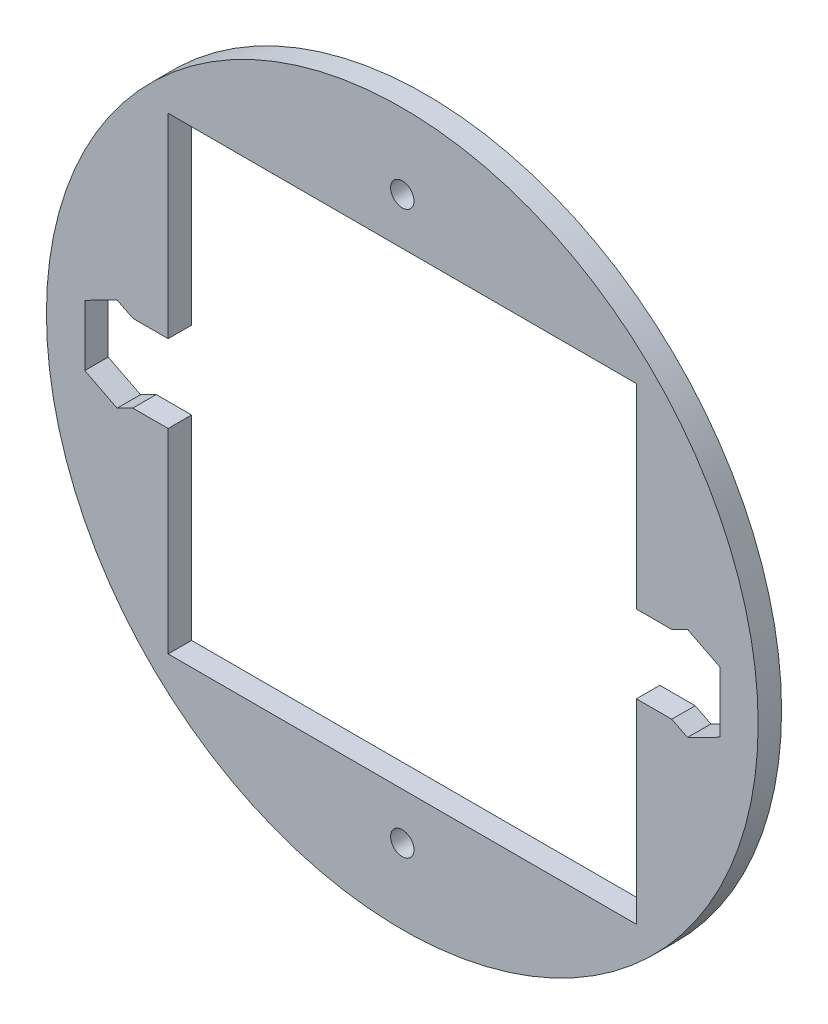
ISO-10303-21;
HEADER;
FILE_DESCRIPTION(('STEP AP214'),'2;1');
FILE_NAME('part.step','',(''),(''),'','','');
FILE_SCHEMA(('AUTOMOTIVE_DESIGN { 1 0 10303 214 1 1 1 1 }'));
ENDSEC;
DATA;
#1=APPLICATION_CONTEXT('core data for automotive mechanical design processes');
#2=APPLICATION_PROTOCOL_DEFINITION('international standard','automotive_design',2000,#1);
#3=PRODUCT_CONTEXT('',#1,'mechanical');
#4=PRODUCT('Part','Part','',(#3));
#5=PRODUCT_RELATED_PRODUCT_CATEGORY('part','',(#4));
#6=PRODUCT_DEFINITION_FORMATION('','',#4);
#7=PRODUCT_DEFINITION_CONTEXT('part definition',#1,'design');
#8=PRODUCT_DEFINITION('design','',#6,#7);
#9=PRODUCT_DEFINITION_SHAPE('','',#8);
#10=(LENGTH_UNIT() NAMED_UNIT(*) SI_UNIT(.MILLI.,.METRE.));
#11=(NAMED_UNIT(*) PLANE_ANGLE_UNIT() SI_UNIT($,.RADIAN.));
#12=(NAMED_UNIT(*) SI_UNIT($,.STERADIAN.) SOLID_ANGLE_UNIT());
#13=UNCERTAINTY_MEASURE_WITH_UNIT(LENGTH_MEASURE(1.E-05),#10,'distance_accuracy_value','');
#14=(GEOMETRIC_REPRESENTATION_CONTEXT(3) GLOBAL_UNCERTAINTY_ASSIGNED_CONTEXT((#13)) GLOBAL_UNIT_ASSIGNED_CONTEXT((#10,
#11,#12)) REPRESENTATION_CONTEXT('',''));
#15=CARTESIAN_POINT('',(0.,0.,0.));
#16=DIRECTION('',(0.,0.,1.));
#17=DIRECTION('',(1.,0.,0.));
#18=AXIS2_PLACEMENT_3D('',#15,#16,#17);
#19=CARTESIAN_POINT('',(-50.,50.,0.));
#20=DIRECTION('',(-1.,0.,0.));
#21=DIRECTION('',(0.,-1.,0.));
#22=AXIS2_PLACEMENT_3D('',#19,#20,#21);
#23=PLANE('',#22);
#24=DIRECTION('',(0.,-1.,0.));
#25=VECTOR('',#24,1.);
#26=CARTESIAN_POINT('',(-50.,50.,0.));
#27=LINE('',#26,#25);
#28=CARTESIAN_POINT('',(-50.,-8.3,0.));
#29=VERTEX_POINT('',#28);
#30=CARTESIAN_POINT('',(-50.,-50.,0.));
#31=VERTEX_POINT('',#30);
#32=EDGE_CURVE('E309',#29,#31,#27,.T.);
#33=ORIENTED_EDGE('',*,*,#32,.F.);
#34=DIRECTION('',(0.,0.,1.));
#35=VECTOR('',#34,1.);
#36=CARTESIAN_POINT('',(-50.,-8.3,0.));
#37=LINE('',#36,#35);
#38=CARTESIAN_POINT('',(-50.,-8.3,5.));
#39=VERTEX_POINT('',#38);
#40=EDGE_CURVE('E226',#29,#39,#37,.T.);
#41=ORIENTED_EDGE('',*,*,#40,.T.);
#42=DIRECTION('',(0.,-1.,0.));
#43=VECTOR('',#42,1.);
#44=CARTESIAN_POINT('',(-50.,50.,5.));
#45=LINE('',#44,#43);
#46=CARTESIAN_POINT('',(-50.,-50.,5.));
#47=VERTEX_POINT('',#46);
#48=EDGE_CURVE('E298',#39,#47,#45,.T.);
#49=ORIENTED_EDGE('',*,*,#48,.T.);
#50=DIRECTION('',(0.,0.,1.));
#51=VECTOR('',#50,1.);
#52=CARTESIAN_POINT('',(-50.,-50.,0.));
#53=LINE('',#52,#51);
#54=EDGE_CURVE('E318',#31,#47,#53,.T.);
#55=ORIENTED_EDGE('',*,*,#54,.F.);
#56=EDGE_LOOP('',(#33,#41,#49,#55));
#57=FACE_BOUND('',#56,.T.);
#58=ADVANCED_FACE('F33',(#57),#23,.F.);
#59=CARTESIAN_POINT('',(50.,50.,0.));
#60=DIRECTION('',(1.,0.,0.));
#61=DIRECTION('',(0.,1.,0.));
#62=AXIS2_PLACEMENT_3D('',#59,#60,#61);
#63=PLANE('',#62);
#64=DIRECTION('',(0.,1.,0.));
#65=VECTOR('',#64,1.);
#66=CARTESIAN_POINT('',(50.,50.,5.));
#67=LINE('',#66,#65);
#68=CARTESIAN_POINT('',(50.,-50.,5.));
#69=VERTEX_POINT('',#68);
#70=CARTESIAN_POINT('',(50.,-8.3,5.));
#71=VERTEX_POINT('',#70);
#72=EDGE_CURVE('E326',#69,#71,#67,.T.);
#73=ORIENTED_EDGE('',*,*,#72,.T.);
#74=DIRECTION('',(0.,0.,1.));
#75=VECTOR('',#74,1.);
#76=CARTESIAN_POINT('',(50.,-8.3,0.));
#77=LINE('',#76,#75);
#78=CARTESIAN_POINT('',(50.,-8.3,0.));
#79=VERTEX_POINT('',#78);
#80=EDGE_CURVE('E290',#79,#71,#77,.T.);
#81=ORIENTED_EDGE('',*,*,#80,.F.);
#82=DIRECTION('',(0.,1.,0.));
#83=VECTOR('',#82,1.);
#84=CARTESIAN_POINT('',(50.,50.,0.));
#85=LINE('',#84,#83);
#86=CARTESIAN_POINT('',(50.,-50.,0.));
#87=VERTEX_POINT('',#86);
#88=EDGE_CURVE('E313',#87,#79,#85,.T.);
#89=ORIENTED_EDGE('',*,*,#88,.F.);
#90=DIRECTION('',(0.,0.,1.));
#91=VECTOR('',#90,1.);
#92=CARTESIAN_POINT('',(50.,-50.,0.));
#93=LINE('',#92,#91);
#94=EDGE_CURVE('E337',#87,#69,#93,.T.);
#95=ORIENTED_EDGE('',*,*,#94,.T.);
#96=EDGE_LOOP('',(#73,#81,#89,#95));
#97=FACE_BOUND('',#96,.T.);
#98=ADVANCED_FACE('F358',(#97),#63,.F.);
#99=CARTESIAN_POINT('',(0.,0.,5.));
#100=DIRECTION('',(0.,0.,-1.));
#101=DIRECTION('',(-1.,0.,0.));
#102=AXIS2_PLACEMENT_3D('',#99,#100,#101);
#103=CYLINDRICAL_SURFACE('',#102,76.);
#104=CARTESIAN_POINT('',(0.,0.,5.));
#105=DIRECTION('',(0.,0.,1.));
#106=DIRECTION('',(1.,0.,0.));
#107=AXIS2_PLACEMENT_3D('',#104,#105,#106);
#108=CIRCLE('',#107,76.);
#109=CARTESIAN_POINT('',(76.,0.,5.));
#110=VERTEX_POINT('',#109);
#111=EDGE_CURVE('E11',#110,#110,#108,.T.);
#112=ORIENTED_EDGE('',*,*,#111,.F.);
#113=EDGE_LOOP('',(#112));
#114=FACE_BOUND('',#113,.T.);
#115=CARTESIAN_POINT('',(0.,0.,0.));
#116=DIRECTION('',(0.,0.,1.));
#117=DIRECTION('',(1.,0.,0.));
#118=AXIS2_PLACEMENT_3D('',#115,#116,#117);
#119=CIRCLE('',#118,76.);
#120=CARTESIAN_POINT('',(76.,0.,0.));
#121=VERTEX_POINT('',#120);
#122=EDGE_CURVE('E37',#121,#121,#119,.T.);
#123=ORIENTED_EDGE('',*,*,#122,.T.);
#124=EDGE_LOOP('',(#123));
#125=FACE_BOUND('',#124,.T.);
#126=ADVANCED_FACE('F35',(#114,#125),#103,.T.);
#127=CARTESIAN_POINT('',(0.,0.,5.));
#128=DIRECTION('',(0.,0.,1.));
#129=DIRECTION('',(1.,0.,0.));
#130=AXIS2_PLACEMENT_3D('',#127,#128,#129);
#131=PLANE('',#130);
#132=DIRECTION('',(1.,0.,0.));
#133=VECTOR('',#132,1.);
#134=CARTESIAN_POINT('',(-50.,-8.3,5.));
#135=LINE('',#134,#133);
#136=CARTESIAN_POINT('',(-57.55,-8.3,5.));
#137=VERTEX_POINT('',#136);
#138=EDGE_CURVE('E194',#137,#39,#135,.T.);
#139=ORIENTED_EDGE('',*,*,#138,.F.);
#140=DIRECTION('',(0.891953238375036,0.452127659574469,0.));
#141=VECTOR('',#140,1.);
#142=CARTESIAN_POINT('',(-57.55,-8.3,5.));
#143=LINE('',#142,#141);
#144=CARTESIAN_POINT('',(-60.9037441762901,-10.,5.));
#145=VERTEX_POINT('',#144);
#146=EDGE_CURVE('E196',#145,#137,#143,.T.);
#147=ORIENTED_EDGE('',*,*,#146,.F.);
#148=DIRECTION('',(0.891918399697068,-0.452196382428941,0.));
#149=VECTOR('',#148,1.);
#150=CARTESIAN_POINT('',(-60.9037441762901,-10.,5.));
#151=LINE('',#150,#149);
#152=CARTESIAN_POINT('',(-67.8071925899454,-6.5,5.));
#153=VERTEX_POINT('',#152);
#154=EDGE_CURVE('E221',#153,#145,#151,.T.);
#155=ORIENTED_EDGE('',*,*,#154,.F.);
#156=DIRECTION('',(0.,-1.,0.));
#157=VECTOR('',#156,1.);
#158=CARTESIAN_POINT('',(-67.8071925899454,-6.5,5.));
#159=LINE('',#158,#157);
#160=CARTESIAN_POINT('',(-67.8071925899454,6.5,5.));
#161=VERTEX_POINT('',#160);
#162=EDGE_CURVE('E218',#161,#153,#159,.T.);
#163=ORIENTED_EDGE('',*,*,#162,.F.);
#164=DIRECTION('',(-0.891918399697068,-0.45219638242894,0.));
#165=VECTOR('',#164,1.);
#166=CARTESIAN_POINT('',(-67.8071925899454,6.5,5.));
#167=LINE('',#166,#165);
#168=CARTESIAN_POINT('',(-60.9037441762901,10.,5.));
#169=VERTEX_POINT('',#168);
#170=EDGE_CURVE('E215',#169,#161,#167,.T.);
#171=ORIENTED_EDGE('',*,*,#170,.F.);
#172=DIRECTION('',(-0.891953238375035,0.45212765957447,0.));
#173=VECTOR('',#172,1.);
#174=CARTESIAN_POINT('',(-60.9037441762901,10.,5.));
#175=LINE('',#174,#173);
#176=CARTESIAN_POINT('',(-57.55,8.3,5.));
#177=VERTEX_POINT('',#176);
#178=EDGE_CURVE('E212',#177,#169,#175,.T.);
#179=ORIENTED_EDGE('',*,*,#178,.F.);
#180=DIRECTION('',(-1.,0.,0.));
#181=VECTOR('',#180,1.);
#182=CARTESIAN_POINT('',(-57.55,8.3,5.));
#183=LINE('',#182,#181);
#184=CARTESIAN_POINT('',(-50.,8.3,5.));
#185=VERTEX_POINT('',#184);
#186=EDGE_CURVE('E172',#185,#177,#183,.T.);
#187=ORIENTED_EDGE('',*,*,#186,.F.);
#188=CARTESIAN_POINT('',(-50.,50.,5.));
#189=VERTEX_POINT('',#188);
#190=EDGE_CURVE('E319',#189,#185,#45,.T.);
#191=ORIENTED_EDGE('',*,*,#190,.F.);
#192=DIRECTION('',(-1.,0.,0.));
#193=VECTOR('',#192,1.);
#194=CARTESIAN_POINT('',(50.,50.,5.));
#195=LINE('',#194,#193);
#196=CARTESIAN_POINT('',(50.,50.,5.));
#197=VERTEX_POINT('',#196);
#198=EDGE_CURVE('E329',#197,#189,#195,.T.);
#199=ORIENTED_EDGE('',*,*,#198,.F.);
#200=CARTESIAN_POINT('',(50.,8.3,5.));
#201=VERTEX_POINT('',#200);
#202=EDGE_CURVE('E325',#201,#197,#67,.T.);
#203=ORIENTED_EDGE('',*,*,#202,.F.);
#204=DIRECTION('',(-1.,0.,0.));
#205=VECTOR('',#204,1.);
#206=CARTESIAN_POINT('',(57.55,8.3,5.));
#207=LINE('',#206,#205);
#208=CARTESIAN_POINT('',(57.55,8.3,5.));
#209=VERTEX_POINT('',#208);
#210=EDGE_CURVE('E56',#209,#201,#207,.T.);
#211=ORIENTED_EDGE('',*,*,#210,.F.);
#212=DIRECTION('',(-0.891953238375037,-0.452127659574467,0.));
#213=VECTOR('',#212,1.);
#214=CARTESIAN_POINT('',(60.9037441762901,9.99999999999999,5.));
#215=LINE('',#214,#213);
#216=CARTESIAN_POINT('',(60.9037441762901,9.99999999999999,5.));
#217=VERTEX_POINT('',#216);
#218=EDGE_CURVE('E263',#217,#209,#215,.T.);
#219=ORIENTED_EDGE('',*,*,#218,.F.);
#220=DIRECTION('',(-0.891918399697068,0.452196382428941,0.));
#221=VECTOR('',#220,1.);
#222=CARTESIAN_POINT('',(67.8071925899454,6.49999999999999,5.));
#223=LINE('',#222,#221);
#224=CARTESIAN_POINT('',(67.8071925899454,6.49999999999999,5.));
#225=VERTEX_POINT('',#224);
#226=EDGE_CURVE('E244',#225,#217,#223,.T.);
#227=ORIENTED_EDGE('',*,*,#226,.F.);
#228=DIRECTION('',(0.,1.,0.));
#229=VECTOR('',#228,1.);
#230=CARTESIAN_POINT('',(67.8071925899454,-6.5,5.));
#231=LINE('',#230,#229);
#232=CARTESIAN_POINT('',(67.8071925899454,-6.5,5.));
#233=VERTEX_POINT('',#232);
#234=EDGE_CURVE('E276',#233,#225,#231,.T.);
#235=ORIENTED_EDGE('',*,*,#234,.F.);
#236=DIRECTION('',(0.891918399697068,0.452196382428941,0.));
#237=VECTOR('',#236,1.);
#238=CARTESIAN_POINT('',(60.9037441762901,-10.,5.));
#239=LINE('',#238,#237);
#240=CARTESIAN_POINT('',(60.9037441762901,-10.,5.));
#241=VERTEX_POINT('',#240);
#242=EDGE_CURVE('E273',#241,#233,#239,.T.);
#243=ORIENTED_EDGE('',*,*,#242,.F.);
#244=DIRECTION('',(0.891953238375036,-0.452127659574469,0.));
#245=VECTOR('',#244,1.);
#246=CARTESIAN_POINT('',(57.55,-8.3,5.));
#247=LINE('',#246,#245);
#248=CARTESIAN_POINT('',(57.55,-8.3,5.));
#249=VERTEX_POINT('',#248);
#250=EDGE_CURVE('E270',#249,#241,#247,.T.);
#251=ORIENTED_EDGE('',*,*,#250,.F.);
#252=DIRECTION('',(1.,0.,0.));
#253=VECTOR('',#252,1.);
#254=CARTESIAN_POINT('',(50.,-8.3,5.));
#255=LINE('',#254,#253);
#256=EDGE_CURVE('E267',#71,#249,#255,.T.);
#257=ORIENTED_EDGE('',*,*,#256,.F.);
#258=ORIENTED_EDGE('',*,*,#72,.F.);
#259=DIRECTION('',(1.,0.,0.));
#260=VECTOR('',#259,1.);
#261=CARTESIAN_POINT('',(50.,-50.,5.));
#262=LINE('',#261,#260);
#263=EDGE_CURVE('E322',#47,#69,#262,.T.);
#264=ORIENTED_EDGE('',*,*,#263,.F.);
#265=ORIENTED_EDGE('',*,*,#48,.F.);
#266=EDGE_LOOP('',(#139,#147,#155,#163,#171,#179,#187,#191,#199,#203,#211,#219,#227,#235,#243,
#251,#257,#258,#264,#265));
#267=FACE_BOUND('',#266,.T.);
#268=CARTESIAN_POINT('',(0.,60.,5.));
#269=DIRECTION('',(0.,0.,1.));
#270=DIRECTION('',(1.,0.,0.));
#271=AXIS2_PLACEMENT_3D('',#268,#269,#270);
#272=CIRCLE('',#271,2.5);
#273=CARTESIAN_POINT('',(2.50000000000001,60.,5.));
#274=VERTEX_POINT('',#273);
#275=EDGE_CURVE('E299',#274,#274,#272,.T.);
#276=ORIENTED_EDGE('',*,*,#275,.F.);
#277=EDGE_LOOP('',(#276));
#278=FACE_BOUND('',#277,.T.);
#279=CARTESIAN_POINT('',(0.,-60.,5.));
#280=DIRECTION('',(0.,0.,1.));
#281=DIRECTION('',(1.,0.,0.));
#282=AXIS2_PLACEMENT_3D('',#279,#280,#281);
#283=CIRCLE('',#282,2.5);
#284=CARTESIAN_POINT('',(2.5,-60.,5.));
#285=VERTEX_POINT('',#284);
#286=EDGE_CURVE('E229',#285,#285,#283,.T.);
#287=ORIENTED_EDGE('',*,*,#286,.F.);
#288=EDGE_LOOP('',(#287));
#289=FACE_BOUND('',#288,.T.);
#290=ORIENTED_EDGE('',*,*,#111,.T.);
#291=EDGE_LOOP('',(#290));
#292=FACE_BOUND('',#291,.T.);
#293=ADVANCED_FACE('F352',(#267,#278,#289,#292),#131,.T.);
#294=CARTESIAN_POINT('',(0.,0.,0.));
#295=DIRECTION('',(0.,0.,1.));
#296=DIRECTION('',(1.,0.,0.));
#297=AXIS2_PLACEMENT_3D('',#294,#295,#296);
#298=PLANE('',#297);
#299=CARTESIAN_POINT('',(0.,60.,0.));
#300=DIRECTION('',(0.,0.,1.));
#301=DIRECTION('',(1.,0.,0.));
#302=AXIS2_PLACEMENT_3D('',#299,#300,#301);
#303=CIRCLE('',#302,2.5);
#304=CARTESIAN_POINT('',(2.50000000000001,60.,0.));
#305=VERTEX_POINT('',#304);
#306=EDGE_CURVE('E295',#305,#305,#303,.T.);
#307=ORIENTED_EDGE('',*,*,#306,.T.);
#308=EDGE_LOOP('',(#307));
#309=FACE_BOUND('',#308,.T.);
#310=CARTESIAN_POINT('',(0.,-60.,0.));
#311=DIRECTION('',(0.,0.,1.));
#312=DIRECTION('',(1.,0.,0.));
#313=AXIS2_PLACEMENT_3D('',#310,#311,#312);
#314=CIRCLE('',#313,2.5);
#315=CARTESIAN_POINT('',(2.5,-60.,0.));
#316=VERTEX_POINT('',#315);
#317=EDGE_CURVE('E302',#316,#316,#314,.T.);
#318=ORIENTED_EDGE('',*,*,#317,.T.);
#319=EDGE_LOOP('',(#318));
#320=FACE_BOUND('',#319,.T.);
#321=DIRECTION('',(0.891953238375036,0.452127659574469,0.));
#322=VECTOR('',#321,1.);
#323=CARTESIAN_POINT('',(-57.55,-8.3,0.));
#324=LINE('',#323,#322);
#325=CARTESIAN_POINT('',(-60.9037441762901,-10.,0.));
#326=VERTEX_POINT('',#325);
#327=CARTESIAN_POINT('',(-57.55,-8.3,0.));
#328=VERTEX_POINT('',#327);
#329=EDGE_CURVE('E206',#326,#328,#324,.T.);
#330=ORIENTED_EDGE('',*,*,#329,.T.);
#331=DIRECTION('',(1.,0.,0.));
#332=VECTOR('',#331,1.);
#333=CARTESIAN_POINT('',(-50.,-8.3,0.));
#334=LINE('',#333,#332);
#335=EDGE_CURVE('E208',#328,#29,#334,.T.);
#336=ORIENTED_EDGE('',*,*,#335,.T.);
#337=ORIENTED_EDGE('',*,*,#32,.T.);
#338=DIRECTION('',(1.,0.,0.));
#339=VECTOR('',#338,1.);
#340=CARTESIAN_POINT('',(50.,-50.,0.));
#341=LINE('',#340,#339);
#342=EDGE_CURVE('E308',#31,#87,#341,.T.);
#343=ORIENTED_EDGE('',*,*,#342,.T.);
#344=ORIENTED_EDGE('',*,*,#88,.T.);
#345=DIRECTION('',(1.,0.,0.));
#346=VECTOR('',#345,1.);
#347=CARTESIAN_POINT('',(50.,-8.3,0.));
#348=LINE('',#347,#346);
#349=CARTESIAN_POINT('',(57.55,-8.3,0.));
#350=VERTEX_POINT('',#349);
#351=EDGE_CURVE('E247',#79,#350,#348,.T.);
#352=ORIENTED_EDGE('',*,*,#351,.T.);
#353=DIRECTION('',(0.891953238375036,-0.452127659574469,0.));
#354=VECTOR('',#353,1.);
#355=CARTESIAN_POINT('',(57.55,-8.3,0.));
#356=LINE('',#355,#354);
#357=CARTESIAN_POINT('',(60.9037441762901,-10.,0.));
#358=VERTEX_POINT('',#357);
#359=EDGE_CURVE('E250',#350,#358,#356,.T.);
#360=ORIENTED_EDGE('',*,*,#359,.T.);
#361=DIRECTION('',(0.891918399697068,0.452196382428941,0.));
#362=VECTOR('',#361,1.);
#363=CARTESIAN_POINT('',(60.9037441762901,-10.,0.));
#364=LINE('',#363,#362);
#365=CARTESIAN_POINT('',(67.8071925899454,-6.5,0.));
#366=VERTEX_POINT('',#365);
#367=EDGE_CURVE('E253',#358,#366,#364,.T.);
#368=ORIENTED_EDGE('',*,*,#367,.T.);
#369=DIRECTION('',(0.,1.,0.));
#370=VECTOR('',#369,1.);
#371=CARTESIAN_POINT('',(67.8071925899454,-6.5,0.));
#372=LINE('',#371,#370);
#373=CARTESIAN_POINT('',(67.8071925899454,6.49999999999999,0.));
#374=VERTEX_POINT('',#373);
#375=EDGE_CURVE('E256',#366,#374,#372,.T.);
#376=ORIENTED_EDGE('',*,*,#375,.T.);
#377=DIRECTION('',(-0.891918399697068,0.452196382428941,0.));
#378=VECTOR('',#377,1.);
#379=CARTESIAN_POINT('',(67.8071925899454,6.49999999999999,0.));
#380=LINE('',#379,#378);
#381=CARTESIAN_POINT('',(60.9037441762901,9.99999999999999,0.));
#382=VERTEX_POINT('',#381);
#383=EDGE_CURVE('E259',#374,#382,#380,.T.);
#384=ORIENTED_EDGE('',*,*,#383,.T.);
#385=DIRECTION('',(-0.891953238375037,-0.452127659574467,0.));
#386=VECTOR('',#385,1.);
#387=CARTESIAN_POINT('',(60.9037441762901,9.99999999999999,0.));
#388=LINE('',#387,#386);
#389=CARTESIAN_POINT('',(57.55,8.3,0.));
#390=VERTEX_POINT('',#389);
#391=EDGE_CURVE('E240',#382,#390,#388,.T.);
#392=ORIENTED_EDGE('',*,*,#391,.T.);
#393=DIRECTION('',(-1.,0.,0.));
#394=VECTOR('',#393,1.);
#395=CARTESIAN_POINT('',(57.55,8.3,0.));
#396=LINE('',#395,#394);
#397=CARTESIAN_POINT('',(50.,8.3,0.));
#398=VERTEX_POINT('',#397);
#399=EDGE_CURVE('E243',#390,#398,#396,.T.);
#400=ORIENTED_EDGE('',*,*,#399,.T.);
#401=CARTESIAN_POINT('',(50.,50.,0.));
#402=VERTEX_POINT('',#401);
#403=EDGE_CURVE('E312',#398,#402,#85,.T.);
#404=ORIENTED_EDGE('',*,*,#403,.T.);
#405=DIRECTION('',(-1.,0.,0.));
#406=VECTOR('',#405,1.);
#407=CARTESIAN_POINT('',(50.,50.,0.));
#408=LINE('',#407,#406);
#409=CARTESIAN_POINT('',(-50.,50.,0.));
#410=VERTEX_POINT('',#409);
#411=EDGE_CURVE('E316',#402,#410,#408,.T.);
#412=ORIENTED_EDGE('',*,*,#411,.T.);
#413=CARTESIAN_POINT('',(-50.,8.3,0.));
#414=VERTEX_POINT('',#413);
#415=EDGE_CURVE('E193',#410,#414,#27,.T.);
#416=ORIENTED_EDGE('',*,*,#415,.T.);
#417=DIRECTION('',(-1.,0.,0.));
#418=VECTOR('',#417,1.);
#419=CARTESIAN_POINT('',(-57.55,8.3,0.));
#420=LINE('',#419,#418);
#421=CARTESIAN_POINT('',(-57.55,8.3,0.));
#422=VERTEX_POINT('',#421);
#423=EDGE_CURVE('E48',#414,#422,#420,.T.);
#424=ORIENTED_EDGE('',*,*,#423,.T.);
#425=DIRECTION('',(-0.891953238375035,0.45212765957447,0.));
#426=VECTOR('',#425,1.);
#427=CARTESIAN_POINT('',(-60.9037441762901,10.,0.));
#428=LINE('',#427,#426);
#429=CARTESIAN_POINT('',(-60.9037441762901,10.,0.));
#430=VERTEX_POINT('',#429);
#431=EDGE_CURVE('E180',#422,#430,#428,.T.);
#432=ORIENTED_EDGE('',*,*,#431,.T.);
#433=DIRECTION('',(-0.891918399697068,-0.45219638242894,0.));
#434=VECTOR('',#433,1.);
#435=CARTESIAN_POINT('',(-67.8071925899454,6.5,0.));
#436=LINE('',#435,#434);
#437=CARTESIAN_POINT('',(-67.8071925899454,6.5,0.));
#438=VERTEX_POINT('',#437);
#439=EDGE_CURVE('E185',#430,#438,#436,.T.);
#440=ORIENTED_EDGE('',*,*,#439,.T.);
#441=DIRECTION('',(0.,-1.,0.));
#442=VECTOR('',#441,1.);
#443=CARTESIAN_POINT('',(-67.8071925899454,-6.5,0.));
#444=LINE('',#443,#442);
#445=CARTESIAN_POINT('',(-67.8071925899454,-6.5,0.));
#446=VERTEX_POINT('',#445);
#447=EDGE_CURVE('E200',#438,#446,#444,.T.);
#448=ORIENTED_EDGE('',*,*,#447,.T.);
#449=DIRECTION('',(0.891918399697068,-0.452196382428941,0.));
#450=VECTOR('',#449,1.);
#451=CARTESIAN_POINT('',(-60.9037441762901,-10.,0.));
#452=LINE('',#451,#450);
#453=EDGE_CURVE('E203',#446,#326,#452,.T.);
#454=ORIENTED_EDGE('',*,*,#453,.T.);
#455=EDGE_LOOP('',(#330,#336,#337,#343,#344,#352,#360,#368,#376,#384,#392,#400,#404,#412,#416,
#424,#432,#440,#448,#454));
#456=FACE_BOUND('',#455,.T.);
#457=ORIENTED_EDGE('',*,*,#122,.F.);
#458=EDGE_LOOP('',(#457));
#459=FACE_BOUND('',#458,.T.);
#460=ADVANCED_FACE('F189',(#309,#320,#456,#459),#298,.F.);
#461=ORIENTED_EDGE('',*,*,#190,.T.);
#462=DIRECTION('',(0.,0.,1.));
#463=VECTOR('',#462,1.);
#464=CARTESIAN_POINT('',(-50.,8.3,0.));
#465=LINE('',#464,#463);
#466=EDGE_CURVE('E177',#414,#185,#465,.T.);
#467=ORIENTED_EDGE('',*,*,#466,.F.);
#468=ORIENTED_EDGE('',*,*,#415,.F.);
#469=DIRECTION('',(0.,0.,1.));
#470=VECTOR('',#469,1.);
#471=CARTESIAN_POINT('',(-50.,50.,0.));
#472=LINE('',#471,#470);
#473=EDGE_CURVE('E332',#410,#189,#472,.T.);
#474=ORIENTED_EDGE('',*,*,#473,.T.);
#475=EDGE_LOOP('',(#461,#467,#468,#474));
#476=FACE_BOUND('',#475,.T.);
#477=ADVANCED_FACE('F387',(#476),#23,.F.);
#478=CARTESIAN_POINT('',(50.,50.,0.));
#479=DIRECTION('',(0.,1.,0.));
#480=DIRECTION('',(-1.,0.,0.));
#481=AXIS2_PLACEMENT_3D('',#478,#479,#480);
#482=PLANE('',#481);
#483=ORIENTED_EDGE('',*,*,#198,.T.);
#484=ORIENTED_EDGE('',*,*,#473,.F.);
#485=ORIENTED_EDGE('',*,*,#411,.F.);
#486=DIRECTION('',(0.,0.,1.));
#487=VECTOR('',#486,1.);
#488=CARTESIAN_POINT('',(50.,50.,0.));
#489=LINE('',#488,#487);
#490=EDGE_CURVE('E334',#402,#197,#489,.T.);
#491=ORIENTED_EDGE('',*,*,#490,.T.);
#492=EDGE_LOOP('',(#483,#484,#485,#491));
#493=FACE_BOUND('',#492,.T.);
#494=ADVANCED_FACE('F396',(#493),#482,.F.);
#495=ORIENTED_EDGE('',*,*,#403,.F.);
#496=DIRECTION('',(0.,0.,1.));
#497=VECTOR('',#496,1.);
#498=CARTESIAN_POINT('',(50.,8.3,0.));
#499=LINE('',#498,#497);
#500=EDGE_CURVE('E292',#398,#201,#499,.T.);
#501=ORIENTED_EDGE('',*,*,#500,.T.);
#502=ORIENTED_EDGE('',*,*,#202,.T.);
#503=ORIENTED_EDGE('',*,*,#490,.F.);
#504=EDGE_LOOP('',(#495,#501,#502,#503));
#505=FACE_BOUND('',#504,.T.);
#506=ADVANCED_FACE('F392',(#505),#63,.F.);
#507=CARTESIAN_POINT('',(50.,-50.,0.));
#508=DIRECTION('',(0.,-1.,0.));
#509=DIRECTION('',(1.,0.,0.));
#510=AXIS2_PLACEMENT_3D('',#507,#508,#509);
#511=PLANE('',#510);
#512=ORIENTED_EDGE('',*,*,#263,.T.);
#513=ORIENTED_EDGE('',*,*,#94,.F.);
#514=ORIENTED_EDGE('',*,*,#342,.F.);
#515=ORIENTED_EDGE('',*,*,#54,.T.);
#516=EDGE_LOOP('',(#512,#513,#514,#515));
#517=FACE_BOUND('',#516,.T.);
#518=ADVANCED_FACE('F344',(#517),#511,.F.);
#519=CARTESIAN_POINT('',(0.,-60.,0.));
#520=DIRECTION('',(0.,0.,1.));
#521=DIRECTION('',(1.,0.,0.));
#522=AXIS2_PLACEMENT_3D('',#519,#520,#521);
#523=CYLINDRICAL_SURFACE('',#522,2.5);
#524=ORIENTED_EDGE('',*,*,#317,.F.);
#525=EDGE_LOOP('',(#524));
#526=FACE_BOUND('',#525,.T.);
#527=ORIENTED_EDGE('',*,*,#286,.T.);
#528=EDGE_LOOP('',(#527));
#529=FACE_BOUND('',#528,.T.);
#530=ADVANCED_FACE('F450',(#526,#529),#523,.F.);
#531=CARTESIAN_POINT('',(0.,60.,0.));
#532=DIRECTION('',(0.,0.,1.));
#533=DIRECTION('',(1.,0.,0.));
#534=AXIS2_PLACEMENT_3D('',#531,#532,#533);
#535=CYLINDRICAL_SURFACE('',#534,2.5);
#536=ORIENTED_EDGE('',*,*,#306,.F.);
#537=EDGE_LOOP('',(#536));
#538=FACE_BOUND('',#537,.T.);
#539=ORIENTED_EDGE('',*,*,#275,.T.);
#540=EDGE_LOOP('',(#539));
#541=FACE_BOUND('',#540,.T.);
#542=ADVANCED_FACE('F447',(#538,#541),#535,.F.);
#543=CARTESIAN_POINT('',(60.9037441762901,9.99999999999999,0.));
#544=DIRECTION('',(-0.452127659574467,0.891953238375037,0.));
#545=DIRECTION('',(-0.891953238375037,-0.452127659574467,0.));
#546=AXIS2_PLACEMENT_3D('',#543,#544,#545);
#547=PLANE('',#546);
#548=ORIENTED_EDGE('',*,*,#218,.T.);
#549=DIRECTION('',(0.,0.,1.));
#550=VECTOR('',#549,1.);
#551=CARTESIAN_POINT('',(57.55,8.3,0.));
#552=LINE('',#551,#550);
#553=EDGE_CURVE('E262',#390,#209,#552,.T.);
#554=ORIENTED_EDGE('',*,*,#553,.F.);
#555=ORIENTED_EDGE('',*,*,#391,.F.);
#556=DIRECTION('',(0.,0.,1.));
#557=VECTOR('',#556,1.);
#558=CARTESIAN_POINT('',(60.9037441762901,9.99999999999999,0.));
#559=LINE('',#558,#557);
#560=EDGE_CURVE('E213',#382,#217,#559,.T.);
#561=ORIENTED_EDGE('',*,*,#560,.T.);
#562=EDGE_LOOP('',(#548,#554,#555,#561));
#563=FACE_BOUND('',#562,.T.);
#564=ADVANCED_FACE('F417',(#563),#547,.F.);
#565=CARTESIAN_POINT('',(67.8071925899454,6.49999999999999,0.));
#566=DIRECTION('',(0.452196382428941,0.891918399697068,0.));
#567=DIRECTION('',(-0.891918399697068,0.452196382428941,0.));
#568=AXIS2_PLACEMENT_3D('',#565,#566,#567);
#569=PLANE('',#568);
#570=ORIENTED_EDGE('',*,*,#226,.T.);
#571=ORIENTED_EDGE('',*,*,#560,.F.);
#572=ORIENTED_EDGE('',*,*,#383,.F.);
#573=DIRECTION('',(0.,0.,1.));
#574=VECTOR('',#573,1.);
#575=CARTESIAN_POINT('',(67.8071925899454,6.49999999999999,0.));
#576=LINE('',#575,#574);
#577=EDGE_CURVE('E282',#374,#225,#576,.T.);
#578=ORIENTED_EDGE('',*,*,#577,.T.);
#579=EDGE_LOOP('',(#570,#571,#572,#578));
#580=FACE_BOUND('',#579,.T.);
#581=ADVANCED_FACE('F423',(#580),#569,.F.);
#582=CARTESIAN_POINT('',(67.8071925899454,-6.5,0.));
#583=DIRECTION('',(1.,0.,0.));
#584=DIRECTION('',(0.,0.,-1.));
#585=AXIS2_PLACEMENT_3D('',#582,#583,#584);
#586=PLANE('',#585);
#587=ORIENTED_EDGE('',*,*,#234,.T.);
#588=ORIENTED_EDGE('',*,*,#577,.F.);
#589=ORIENTED_EDGE('',*,*,#375,.F.);
#590=DIRECTION('',(0.,0.,1.));
#591=VECTOR('',#590,1.);
#592=CARTESIAN_POINT('',(67.8071925899454,-6.5,0.));
#593=LINE('',#592,#591);
#594=EDGE_CURVE('E284',#366,#233,#593,.T.);
#595=ORIENTED_EDGE('',*,*,#594,.T.);
#596=EDGE_LOOP('',(#587,#588,#589,#595));
#597=FACE_BOUND('',#596,.T.);
#598=ADVANCED_FACE('F426',(#597),#586,.F.);
#599=CARTESIAN_POINT('',(60.9037441762901,-10.,0.));
#600=DIRECTION('',(0.452196382428941,-0.891918399697068,0.));
#601=DIRECTION('',(0.891918399697068,0.452196382428941,0.));
#602=AXIS2_PLACEMENT_3D('',#599,#600,#601);
#603=PLANE('',#602);
#604=ORIENTED_EDGE('',*,*,#242,.T.);
#605=ORIENTED_EDGE('',*,*,#594,.F.);
#606=ORIENTED_EDGE('',*,*,#367,.F.);
#607=DIRECTION('',(0.,0.,1.));
#608=VECTOR('',#607,1.);
#609=CARTESIAN_POINT('',(60.9037441762901,-10.,0.));
#610=LINE('',#609,#608);
#611=EDGE_CURVE('E286',#358,#241,#610,.T.);
#612=ORIENTED_EDGE('',*,*,#611,.T.);
#613=EDGE_LOOP('',(#604,#605,#606,#612));
#614=FACE_BOUND('',#613,.T.);
#615=ADVANCED_FACE('F429',(#614),#603,.F.);
#616=CARTESIAN_POINT('',(57.55,-8.3,0.));
#617=DIRECTION('',(-0.452127659574469,-0.891953238375036,0.));
#618=DIRECTION('',(0.891953238375036,-0.452127659574469,0.));
#619=AXIS2_PLACEMENT_3D('',#616,#617,#618);
#620=PLANE('',#619);
#621=ORIENTED_EDGE('',*,*,#250,.T.);
#622=ORIENTED_EDGE('',*,*,#611,.F.);
#623=ORIENTED_EDGE('',*,*,#359,.F.);
#624=DIRECTION('',(0.,0.,1.));
#625=VECTOR('',#624,1.);
#626=CARTESIAN_POINT('',(57.55,-8.3,0.));
#627=LINE('',#626,#625);
#628=EDGE_CURVE('E288',#350,#249,#627,.T.);
#629=ORIENTED_EDGE('',*,*,#628,.T.);
#630=EDGE_LOOP('',(#621,#622,#623,#629));
#631=FACE_BOUND('',#630,.T.);
#632=ADVANCED_FACE('F431',(#631),#620,.F.);
#633=CARTESIAN_POINT('',(50.,-8.3,0.));
#634=DIRECTION('',(0.,-1.,0.));
#635=DIRECTION('',(0.,0.,-1.));
#636=AXIS2_PLACEMENT_3D('',#633,#634,#635);
#637=PLANE('',#636);
#638=ORIENTED_EDGE('',*,*,#256,.T.);
#639=ORIENTED_EDGE('',*,*,#628,.F.);
#640=ORIENTED_EDGE('',*,*,#351,.F.);
#641=ORIENTED_EDGE('',*,*,#80,.T.);
#642=EDGE_LOOP('',(#638,#639,#640,#641));
#643=FACE_BOUND('',#642,.T.);
#644=ADVANCED_FACE('F434',(#643),#637,.F.);
#645=CARTESIAN_POINT('',(57.55,8.3,0.));
#646=DIRECTION('',(0.,1.,0.));
#647=DIRECTION('',(0.,0.,1.));
#648=AXIS2_PLACEMENT_3D('',#645,#646,#647);
#649=PLANE('',#648);
#650=ORIENTED_EDGE('',*,*,#210,.T.);
#651=ORIENTED_EDGE('',*,*,#500,.F.);
#652=ORIENTED_EDGE('',*,*,#399,.F.);
#653=ORIENTED_EDGE('',*,*,#553,.T.);
#654=EDGE_LOOP('',(#650,#651,#652,#653));
#655=FACE_BOUND('',#654,.T.);
#656=ADVANCED_FACE('F413',(#655),#649,.F.);
#657=CARTESIAN_POINT('',(-50.,-8.3,0.));
#658=DIRECTION('',(0.,-1.,0.));
#659=DIRECTION('',(0.,0.,-1.));
#660=AXIS2_PLACEMENT_3D('',#657,#658,#659);
#661=PLANE('',#660);
#662=ORIENTED_EDGE('',*,*,#138,.T.);
#663=ORIENTED_EDGE('',*,*,#40,.F.);
#664=ORIENTED_EDGE('',*,*,#335,.F.);
#665=DIRECTION('',(0.,0.,1.));
#666=VECTOR('',#665,1.);
#667=CARTESIAN_POINT('',(-57.55,-8.3,0.));
#668=LINE('',#667,#666);
#669=EDGE_CURVE('E230',#328,#137,#668,.T.);
#670=ORIENTED_EDGE('',*,*,#669,.T.);
#671=EDGE_LOOP('',(#662,#663,#664,#670));
#672=FACE_BOUND('',#671,.T.);
#673=ADVANCED_FACE('F361',(#672),#661,.F.);
#674=CARTESIAN_POINT('',(-57.55,-8.3,0.));
#675=DIRECTION('',(0.452127659574469,-0.891953238375036,0.));
#676=DIRECTION('',(0.891953238375036,0.452127659574469,0.));
#677=AXIS2_PLACEMENT_3D('',#674,#675,#676);
#678=PLANE('',#677);
#679=ORIENTED_EDGE('',*,*,#146,.T.);
#680=ORIENTED_EDGE('',*,*,#669,.F.);
#681=ORIENTED_EDGE('',*,*,#329,.F.);
#682=DIRECTION('',(0.,0.,1.));
#683=VECTOR('',#682,1.);
#684=CARTESIAN_POINT('',(-60.9037441762901,-10.,0.));
#685=LINE('',#684,#683);
#686=EDGE_CURVE('E232',#326,#145,#685,.T.);
#687=ORIENTED_EDGE('',*,*,#686,.T.);
#688=EDGE_LOOP('',(#679,#680,#681,#687));
#689=FACE_BOUND('',#688,.T.);
#690=ADVANCED_FACE('F366',(#689),#678,.F.);
#691=CARTESIAN_POINT('',(-60.9037441762901,-10.,0.));
#692=DIRECTION('',(-0.452196382428941,-0.891918399697068,0.));
#693=DIRECTION('',(0.891918399697068,-0.452196382428941,0.));
#694=AXIS2_PLACEMENT_3D('',#691,#692,#693);
#695=PLANE('',#694);
#696=ORIENTED_EDGE('',*,*,#154,.T.);
#697=ORIENTED_EDGE('',*,*,#686,.F.);
#698=ORIENTED_EDGE('',*,*,#453,.F.);
#699=DIRECTION('',(0.,0.,1.));
#700=VECTOR('',#699,1.);
#701=CARTESIAN_POINT('',(-67.8071925899454,-6.5,0.));
#702=LINE('',#701,#700);
#703=EDGE_CURVE('E234',#446,#153,#702,.T.);
#704=ORIENTED_EDGE('',*,*,#703,.T.);
#705=EDGE_LOOP('',(#696,#697,#698,#704));
#706=FACE_BOUND('',#705,.T.);
#707=ADVANCED_FACE('F370',(#706),#695,.F.);
#708=CARTESIAN_POINT('',(-67.8071925899454,-6.5,0.));
#709=DIRECTION('',(-1.,0.,0.));
#710=DIRECTION('',(0.,0.,1.));
#711=AXIS2_PLACEMENT_3D('',#708,#709,#710);
#712=PLANE('',#711);
#713=ORIENTED_EDGE('',*,*,#162,.T.);
#714=ORIENTED_EDGE('',*,*,#703,.F.);
#715=ORIENTED_EDGE('',*,*,#447,.F.);
#716=DIRECTION('',(0.,0.,1.));
#717=VECTOR('',#716,1.);
#718=CARTESIAN_POINT('',(-67.8071925899454,6.5,0.));
#719=LINE('',#718,#717);
#720=EDGE_CURVE('E236',#438,#161,#719,.T.);
#721=ORIENTED_EDGE('',*,*,#720,.T.);
#722=EDGE_LOOP('',(#713,#714,#715,#721));
#723=FACE_BOUND('',#722,.T.);
#724=ADVANCED_FACE('F373',(#723),#712,.F.);
#725=CARTESIAN_POINT('',(-67.8071925899454,6.5,0.));
#726=DIRECTION('',(-0.45219638242894,0.891918399697068,0.));
#727=DIRECTION('',(-0.891918399697069,-0.45219638242894,0.));
#728=AXIS2_PLACEMENT_3D('',#725,#726,#727);
#729=PLANE('',#728);
#730=ORIENTED_EDGE('',*,*,#170,.T.);
#731=ORIENTED_EDGE('',*,*,#720,.F.);
#732=ORIENTED_EDGE('',*,*,#439,.F.);
#733=DIRECTION('',(0.,0.,1.));
#734=VECTOR('',#733,1.);
#735=CARTESIAN_POINT('',(-60.9037441762901,10.,0.));
#736=LINE('',#735,#734);
#737=EDGE_CURVE('E176',#430,#169,#736,.T.);
#738=ORIENTED_EDGE('',*,*,#737,.T.);
#739=EDGE_LOOP('',(#730,#731,#732,#738));
#740=FACE_BOUND('',#739,.T.);
#741=ADVANCED_FACE('F376',(#740),#729,.F.);
#742=CARTESIAN_POINT('',(-60.9037441762901,10.,0.));
#743=DIRECTION('',(0.45212765957447,0.891953238375035,0.));
#744=DIRECTION('',(-0.891953238375035,0.45212765957447,0.));
#745=AXIS2_PLACEMENT_3D('',#742,#743,#744);
#746=PLANE('',#745);
#747=ORIENTED_EDGE('',*,*,#178,.T.);
#748=ORIENTED_EDGE('',*,*,#737,.F.);
#749=ORIENTED_EDGE('',*,*,#431,.F.);
#750=DIRECTION('',(0.,0.,1.));
#751=VECTOR('',#750,1.);
#752=CARTESIAN_POINT('',(-57.55,8.3,0.));
#753=LINE('',#752,#751);
#754=EDGE_CURVE('E168',#422,#177,#753,.T.);
#755=ORIENTED_EDGE('',*,*,#754,.T.);
#756=EDGE_LOOP('',(#747,#748,#749,#755));
#757=FACE_BOUND('',#756,.T.);
#758=ADVANCED_FACE('F181',(#757),#746,.F.);
#759=CARTESIAN_POINT('',(-57.55,8.3,0.));
#760=DIRECTION('',(0.,1.,0.));
#761=DIRECTION('',(0.,0.,1.));
#762=AXIS2_PLACEMENT_3D('',#759,#760,#761);
#763=PLANE('',#762);
#764=ORIENTED_EDGE('',*,*,#186,.T.);
#765=ORIENTED_EDGE('',*,*,#754,.F.);
#766=ORIENTED_EDGE('',*,*,#423,.F.);
#767=ORIENTED_EDGE('',*,*,#466,.T.);
#768=EDGE_LOOP('',(#764,#765,#766,#767));
#769=FACE_BOUND('',#768,.T.);
#770=ADVANCED_FACE('F170',(#769),#763,.F.);
#771=CLOSED_SHELL('',(#58,#98,#126,#293,#460,#477,#494,#506,#518,#530,#542,#564,#581,#598,#615,
#632,#644,#656,#673,#690,#707,#724,#741,#758,#770));
#772=MANIFOLD_SOLID_BREP('B2',#771);
#773=ADVANCED_BREP_SHAPE_REPRESENTATION('',(#18,#772),#14);
#774=SHAPE_DEFINITION_REPRESENTATION(#9,#773);
ENDSEC;
END-ISO-10303-21;
